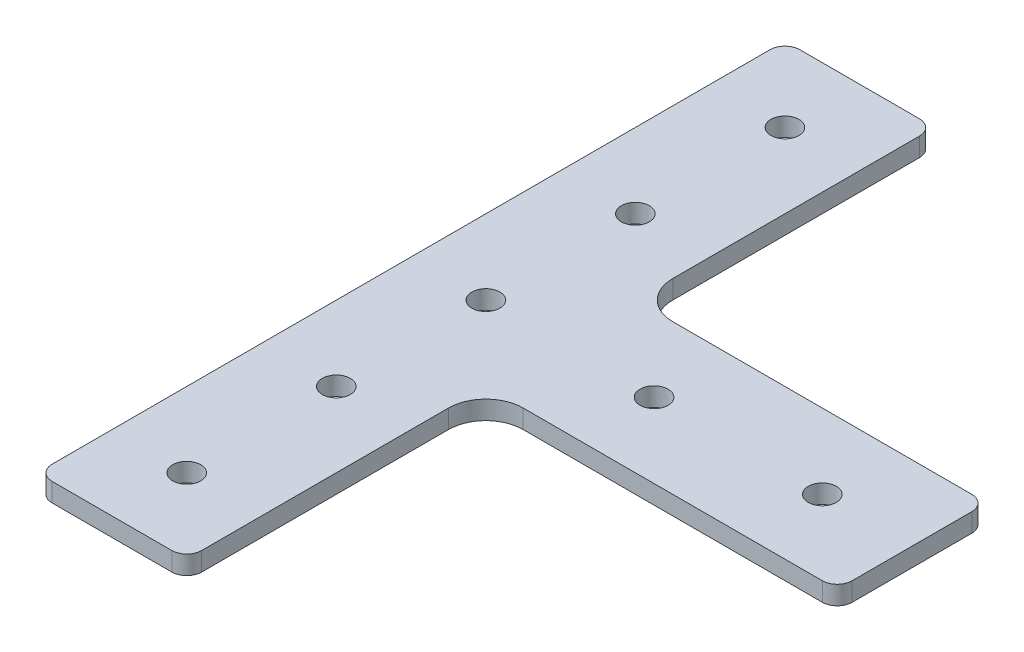
ISO-10303-21;
HEADER;
FILE_DESCRIPTION(('STEP AP214'),'2;1');
FILE_NAME('part.step','',(''),(''),'','','');
FILE_SCHEMA(('AUTOMOTIVE_DESIGN { 1 0 10303 214 1 1 1 1 }'));
ENDSEC;
DATA;
#1=APPLICATION_CONTEXT('core data for automotive mechanical design processes');
#2=APPLICATION_PROTOCOL_DEFINITION('international standard','automotive_design',2000,#1);
#3=PRODUCT_CONTEXT('',#1,'mechanical');
#4=PRODUCT('Part','Part','',(#3));
#5=PRODUCT_RELATED_PRODUCT_CATEGORY('part','',(#4));
#6=PRODUCT_DEFINITION_FORMATION('','',#4);
#7=PRODUCT_DEFINITION_CONTEXT('part definition',#1,'design');
#8=PRODUCT_DEFINITION('design','',#6,#7);
#9=PRODUCT_DEFINITION_SHAPE('','',#8);
#10=(LENGTH_UNIT() NAMED_UNIT(*) SI_UNIT(.MILLI.,.METRE.));
#11=(NAMED_UNIT(*) PLANE_ANGLE_UNIT() SI_UNIT($,.RADIAN.));
#12=(NAMED_UNIT(*) SI_UNIT($,.STERADIAN.) SOLID_ANGLE_UNIT());
#13=UNCERTAINTY_MEASURE_WITH_UNIT(LENGTH_MEASURE(1.E-05),#10,'distance_accuracy_value','');
#14=(GEOMETRIC_REPRESENTATION_CONTEXT(3) GLOBAL_UNCERTAINTY_ASSIGNED_CONTEXT((#13)) GLOBAL_UNIT_ASSIGNED_CONTEXT((#10,
#11,#12)) REPRESENTATION_CONTEXT('',''));
#15=CARTESIAN_POINT('',(0.,0.,0.));
#16=DIRECTION('',(0.,0.,1.));
#17=DIRECTION('',(1.,0.,0.));
#18=AXIS2_PLACEMENT_3D('',#15,#16,#17);
#19=CARTESIAN_POINT('',(19.05,3.175,44.45));
#20=DIRECTION('',(0.,-1.,0.));
#21=DIRECTION('',(0.,0.,-1.));
#22=AXIS2_PLACEMENT_3D('',#19,#20,#21);
#23=PLANE('',#22);
#24=CARTESIAN_POINT('',(19.05,3.175,44.45));
#25=DIRECTION('',(0.,-1.,0.));
#26=DIRECTION('',(0.,0.,-1.));
#27=AXIS2_PLACEMENT_3D('',#24,#25,#26);
#28=CIRCLE('',#27,6.35);
#29=CARTESIAN_POINT('',(12.7,3.175,44.45));
#30=VERTEX_POINT('',#29);
#31=CARTESIAN_POINT('',(19.0500000000001,3.175,38.1));
#32=VERTEX_POINT('',#31);
#33=EDGE_CURVE('E210',#30,#32,#28,.T.);
#34=ORIENTED_EDGE('',*,*,#33,.T.);
#35=DIRECTION('',(1.,0.,0.));
#36=VECTOR('',#35,1.);
#37=CARTESIAN_POINT('',(19.0500000000001,3.175,38.1));
#38=LINE('',#37,#36);
#39=CARTESIAN_POINT('',(69.85,3.175,38.1));
#40=VERTEX_POINT('',#39);
#41=EDGE_CURVE('E117',#32,#40,#38,.T.);
#42=ORIENTED_EDGE('',*,*,#41,.T.);
#43=CARTESIAN_POINT('',(69.85,3.175,35.56));
#44=DIRECTION('',(0.,1.,0.));
#45=DIRECTION('',(0.,0.,1.));
#46=AXIS2_PLACEMENT_3D('',#43,#44,#45);
#47=CIRCLE('',#46,2.54);
#48=CARTESIAN_POINT('',(72.39,3.175,35.56));
#49=VERTEX_POINT('',#48);
#50=EDGE_CURVE('E249',#40,#49,#47,.T.);
#51=ORIENTED_EDGE('',*,*,#50,.T.);
#52=DIRECTION('',(0.,0.,-1.));
#53=VECTOR('',#52,1.);
#54=CARTESIAN_POINT('',(72.39,3.175,35.56));
#55=LINE('',#54,#53);
#56=CARTESIAN_POINT('',(72.39,3.175,15.24));
#57=VERTEX_POINT('',#56);
#58=EDGE_CURVE('E268',#49,#57,#55,.T.);
#59=ORIENTED_EDGE('',*,*,#58,.T.);
#60=CARTESIAN_POINT('',(69.85,3.175,15.24));
#61=DIRECTION('',(0.,1.,0.));
#62=DIRECTION('',(0.,0.,1.));
#63=AXIS2_PLACEMENT_3D('',#60,#61,#62);
#64=CIRCLE('',#63,2.54);
#65=CARTESIAN_POINT('',(69.85,3.175,12.7));
#66=VERTEX_POINT('',#65);
#67=EDGE_CURVE('E265',#57,#66,#64,.T.);
#68=ORIENTED_EDGE('',*,*,#67,.T.);
#69=DIRECTION('',(-1.,0.,0.));
#70=VECTOR('',#69,1.);
#71=CARTESIAN_POINT('',(19.05,3.175,12.7));
#72=LINE('',#71,#70);
#73=CARTESIAN_POINT('',(19.05,3.175,12.7));
#74=VERTEX_POINT('',#73);
#75=EDGE_CURVE('E267',#66,#74,#72,.T.);
#76=ORIENTED_EDGE('',*,*,#75,.T.);
#77=CARTESIAN_POINT('',(19.05,3.175,6.35));
#78=DIRECTION('',(0.,-1.,0.));
#79=DIRECTION('',(0.,0.,-1.));
#80=AXIS2_PLACEMENT_3D('',#77,#78,#79);
#81=CIRCLE('',#80,6.35);
#82=CARTESIAN_POINT('',(12.7,3.175,6.35));
#83=VERTEX_POINT('',#82);
#84=EDGE_CURVE('E270',#74,#83,#81,.T.);
#85=ORIENTED_EDGE('',*,*,#84,.T.);
#86=DIRECTION('',(0.,0.,-1.));
#87=VECTOR('',#86,1.);
#88=CARTESIAN_POINT('',(12.7,3.175,6.35));
#89=LINE('',#88,#87);
#90=CARTESIAN_POINT('',(12.7,3.175,-35.56));
#91=VERTEX_POINT('',#90);
#92=EDGE_CURVE('E276',#83,#91,#89,.T.);
#93=ORIENTED_EDGE('',*,*,#92,.T.);
#94=CARTESIAN_POINT('',(10.16,3.175,-35.56));
#95=DIRECTION('',(0.,1.,0.));
#96=DIRECTION('',(0.,0.,1.));
#97=AXIS2_PLACEMENT_3D('',#94,#95,#96);
#98=CIRCLE('',#97,2.54);
#99=CARTESIAN_POINT('',(10.16,3.175,-38.1));
#100=VERTEX_POINT('',#99);
#101=EDGE_CURVE('E278',#91,#100,#98,.T.);
#102=ORIENTED_EDGE('',*,*,#101,.T.);
#103=DIRECTION('',(-1.,0.,0.));
#104=VECTOR('',#103,1.);
#105=CARTESIAN_POINT('',(-10.16,3.175,-38.1));
#106=LINE('',#105,#104);
#107=CARTESIAN_POINT('',(-10.16,3.175,-38.1));
#108=VERTEX_POINT('',#107);
#109=EDGE_CURVE('E280',#100,#108,#106,.T.);
#110=ORIENTED_EDGE('',*,*,#109,.T.);
#111=CARTESIAN_POINT('',(-10.16,3.175,-35.56));
#112=DIRECTION('',(0.,1.,0.));
#113=DIRECTION('',(0.,0.,-1.));
#114=AXIS2_PLACEMENT_3D('',#111,#112,#113);
#115=CIRCLE('',#114,2.54);
#116=CARTESIAN_POINT('',(-12.7,3.175,-35.56));
#117=VERTEX_POINT('',#116);
#118=EDGE_CURVE('E282',#108,#117,#115,.T.);
#119=ORIENTED_EDGE('',*,*,#118,.T.);
#120=DIRECTION('',(0.,0.,1.));
#121=VECTOR('',#120,1.);
#122=CARTESIAN_POINT('',(-12.7,3.175,35.56));
#123=LINE('',#122,#121);
#124=CARTESIAN_POINT('',(-12.7,3.175,86.36));
#125=VERTEX_POINT('',#124);
#126=EDGE_CURVE('E284',#117,#125,#123,.T.);
#127=ORIENTED_EDGE('',*,*,#126,.T.);
#128=CARTESIAN_POINT('',(-10.16,3.175,86.36));
#129=DIRECTION('',(0.,1.,0.));
#130=DIRECTION('',(0.,0.,-1.));
#131=AXIS2_PLACEMENT_3D('',#128,#129,#130);
#132=CIRCLE('',#131,2.54);
#133=CARTESIAN_POINT('',(-10.16,3.175,88.9));
#134=VERTEX_POINT('',#133);
#135=EDGE_CURVE('E160',#125,#134,#132,.T.);
#136=ORIENTED_EDGE('',*,*,#135,.T.);
#137=DIRECTION('',(1.,0.,0.));
#138=VECTOR('',#137,1.);
#139=CARTESIAN_POINT('',(10.16,3.175,88.9));
#140=LINE('',#139,#138);
#141=CARTESIAN_POINT('',(10.16,3.175,88.9));
#142=VERTEX_POINT('',#141);
#143=EDGE_CURVE('E154',#134,#142,#140,.T.);
#144=ORIENTED_EDGE('',*,*,#143,.T.);
#145=CARTESIAN_POINT('',(10.16,3.175,86.36));
#146=DIRECTION('',(0.,1.,0.));
#147=DIRECTION('',(0.,0.,-1.));
#148=AXIS2_PLACEMENT_3D('',#145,#146,#147);
#149=CIRCLE('',#148,2.54);
#150=CARTESIAN_POINT('',(12.7,3.175,86.36));
#151=VERTEX_POINT('',#150);
#152=EDGE_CURVE('E158',#142,#151,#149,.T.);
#153=ORIENTED_EDGE('',*,*,#152,.T.);
#154=DIRECTION('',(0.,0.,-1.));
#155=VECTOR('',#154,1.);
#156=CARTESIAN_POINT('',(12.7,3.175,44.45));
#157=LINE('',#156,#155);
#158=EDGE_CURVE('E50',#151,#30,#157,.T.);
#159=ORIENTED_EDGE('',*,*,#158,.T.);
#160=EDGE_LOOP('',(#34,#42,#51,#59,#68,#76,#85,#93,#102,#110,#119,#127,#136,#144,#153,#159));
#161=FACE_BOUND('',#160,.T.);
#162=CARTESIAN_POINT('',(0.,3.175,25.4));
#163=DIRECTION('',(0.,1.,0.));
#164=DIRECTION('',(0.,0.,1.));
#165=AXIS2_PLACEMENT_3D('',#162,#163,#164);
#166=CIRCLE('',#165,2.38125);
#167=CARTESIAN_POINT('',(0.,3.175,27.78125));
#168=VERTEX_POINT('',#167);
#169=EDGE_CURVE('E182',#168,#168,#166,.T.);
#170=ORIENTED_EDGE('',*,*,#169,.F.);
#171=EDGE_LOOP('',(#170));
#172=FACE_BOUND('',#171,.T.);
#173=CARTESIAN_POINT('',(0.,3.175,0.));
#174=DIRECTION('',(0.,1.,0.));
#175=DIRECTION('',(0.,0.,1.));
#176=AXIS2_PLACEMENT_3D('',#173,#174,#175);
#177=CIRCLE('',#176,2.38125);
#178=CARTESIAN_POINT('',(0.,3.175,2.38125));
#179=VERTEX_POINT('',#178);
#180=EDGE_CURVE('E377',#179,#179,#177,.T.);
#181=ORIENTED_EDGE('',*,*,#180,.F.);
#182=EDGE_LOOP('',(#181));
#183=FACE_BOUND('',#182,.T.);
#184=CARTESIAN_POINT('',(0.,3.175,-25.4));
#185=DIRECTION('',(0.,1.,0.));
#186=DIRECTION('',(0.,0.,1.));
#187=AXIS2_PLACEMENT_3D('',#184,#185,#186);
#188=CIRCLE('',#187,2.38125);
#189=CARTESIAN_POINT('',(0.,3.175,-23.01875));
#190=VERTEX_POINT('',#189);
#191=EDGE_CURVE('E371',#190,#190,#188,.T.);
#192=ORIENTED_EDGE('',*,*,#191,.F.);
#193=EDGE_LOOP('',(#192));
#194=FACE_BOUND('',#193,.T.);
#195=CARTESIAN_POINT('',(28.575,3.175,25.4));
#196=DIRECTION('',(0.,1.,0.));
#197=DIRECTION('',(0.,0.,1.));
#198=AXIS2_PLACEMENT_3D('',#195,#196,#197);
#199=CIRCLE('',#198,2.38125);
#200=CARTESIAN_POINT('',(28.575,3.175,27.78125));
#201=VERTEX_POINT('',#200);
#202=EDGE_CURVE('E365',#201,#201,#199,.T.);
#203=ORIENTED_EDGE('',*,*,#202,.F.);
#204=EDGE_LOOP('',(#203));
#205=FACE_BOUND('',#204,.T.);
#206=CARTESIAN_POINT('',(57.15,3.175,25.4));
#207=DIRECTION('',(0.,1.,0.));
#208=DIRECTION('',(0.,0.,1.));
#209=AXIS2_PLACEMENT_3D('',#206,#207,#208);
#210=CIRCLE('',#209,2.38125);
#211=CARTESIAN_POINT('',(57.15,3.175,27.78125));
#212=VERTEX_POINT('',#211);
#213=EDGE_CURVE('E359',#212,#212,#210,.T.);
#214=ORIENTED_EDGE('',*,*,#213,.F.);
#215=EDGE_LOOP('',(#214));
#216=FACE_BOUND('',#215,.T.);
#217=CARTESIAN_POINT('',(0.,3.175,76.2));
#218=DIRECTION('',(0.,1.,0.));
#219=DIRECTION('',(0.,0.,-1.));
#220=AXIS2_PLACEMENT_3D('',#217,#218,#219);
#221=CIRCLE('',#220,2.38125);
#222=CARTESIAN_POINT('',(0.,3.175,73.81875));
#223=VERTEX_POINT('',#222);
#224=EDGE_CURVE('E353',#223,#223,#221,.T.);
#225=ORIENTED_EDGE('',*,*,#224,.F.);
#226=EDGE_LOOP('',(#225));
#227=FACE_BOUND('',#226,.T.);
#228=CARTESIAN_POINT('',(0.,3.175,50.8));
#229=DIRECTION('',(0.,1.,0.));
#230=DIRECTION('',(0.,0.,-1.));
#231=AXIS2_PLACEMENT_3D('',#228,#229,#230);
#232=CIRCLE('',#231,2.38125);
#233=CARTESIAN_POINT('',(0.,3.175,48.41875));
#234=VERTEX_POINT('',#233);
#235=EDGE_CURVE('E344',#234,#234,#232,.T.);
#236=ORIENTED_EDGE('',*,*,#235,.F.);
#237=EDGE_LOOP('',(#236));
#238=FACE_BOUND('',#237,.T.);
#239=ADVANCED_FACE('F33',(#161,#172,#183,#194,#205,#216,#227,#238),#23,.F.);
#240=CARTESIAN_POINT('',(19.05,0.,44.45));
#241=DIRECTION('',(0.,-1.,0.));
#242=DIRECTION('',(0.,0.,-1.));
#243=AXIS2_PLACEMENT_3D('',#240,#241,#242);
#244=PLANE('',#243);
#245=CARTESIAN_POINT('',(0.,0.,76.2));
#246=DIRECTION('',(0.,1.,0.));
#247=DIRECTION('',(0.,0.,-1.));
#248=AXIS2_PLACEMENT_3D('',#245,#246,#247);
#249=CIRCLE('',#248,2.38125);
#250=CARTESIAN_POINT('',(0.,0.,73.81875));
#251=VERTEX_POINT('',#250);
#252=EDGE_CURVE('E350',#251,#251,#249,.T.);
#253=ORIENTED_EDGE('',*,*,#252,.T.);
#254=EDGE_LOOP('',(#253));
#255=FACE_BOUND('',#254,.T.);
#256=CARTESIAN_POINT('',(28.575,0.,25.4));
#257=DIRECTION('',(0.,1.,0.));
#258=DIRECTION('',(0.,0.,1.));
#259=AXIS2_PLACEMENT_3D('',#256,#257,#258);
#260=CIRCLE('',#259,2.38125);
#261=CARTESIAN_POINT('',(28.575,0.,27.78125));
#262=VERTEX_POINT('',#261);
#263=EDGE_CURVE('E362',#262,#262,#260,.T.);
#264=ORIENTED_EDGE('',*,*,#263,.T.);
#265=EDGE_LOOP('',(#264));
#266=FACE_BOUND('',#265,.T.);
#267=CARTESIAN_POINT('',(0.,0.,0.));
#268=DIRECTION('',(0.,1.,0.));
#269=DIRECTION('',(0.,0.,1.));
#270=AXIS2_PLACEMENT_3D('',#267,#268,#269);
#271=CIRCLE('',#270,2.38125);
#272=CARTESIAN_POINT('',(0.,0.,2.38125));
#273=VERTEX_POINT('',#272);
#274=EDGE_CURVE('E374',#273,#273,#271,.T.);
#275=ORIENTED_EDGE('',*,*,#274,.T.);
#276=EDGE_LOOP('',(#275));
#277=FACE_BOUND('',#276,.T.);
#278=CARTESIAN_POINT('',(19.05,0.,44.45));
#279=DIRECTION('',(0.,-1.,0.));
#280=DIRECTION('',(0.,0.,-1.));
#281=AXIS2_PLACEMENT_3D('',#278,#279,#280);
#282=CIRCLE('',#281,6.35);
#283=CARTESIAN_POINT('',(12.7,0.,44.45));
#284=VERTEX_POINT('',#283);
#285=CARTESIAN_POINT('',(19.0500000000001,0.,38.1));
#286=VERTEX_POINT('',#285);
#287=EDGE_CURVE('E178',#284,#286,#282,.T.);
#288=ORIENTED_EDGE('',*,*,#287,.F.);
#289=DIRECTION('',(0.,0.,-1.));
#290=VECTOR('',#289,1.);
#291=CARTESIAN_POINT('',(12.7,0.,44.45));
#292=LINE('',#291,#290);
#293=CARTESIAN_POINT('',(12.7,0.,86.36));
#294=VERTEX_POINT('',#293);
#295=EDGE_CURVE('E109',#294,#284,#292,.T.);
#296=ORIENTED_EDGE('',*,*,#295,.F.);
#297=CARTESIAN_POINT('',(10.16,0.,86.36));
#298=DIRECTION('',(0.,1.,0.));
#299=DIRECTION('',(0.,0.,-1.));
#300=AXIS2_PLACEMENT_3D('',#297,#298,#299);
#301=CIRCLE('',#300,2.54);
#302=CARTESIAN_POINT('',(10.16,0.,88.9));
#303=VERTEX_POINT('',#302);
#304=EDGE_CURVE('E103',#303,#294,#301,.T.);
#305=ORIENTED_EDGE('',*,*,#304,.F.);
#306=DIRECTION('',(1.,0.,0.));
#307=VECTOR('',#306,1.);
#308=CARTESIAN_POINT('',(10.16,0.,88.9));
#309=LINE('',#308,#307);
#310=CARTESIAN_POINT('',(-10.16,0.,88.9));
#311=VERTEX_POINT('',#310);
#312=EDGE_CURVE('E168',#311,#303,#309,.T.);
#313=ORIENTED_EDGE('',*,*,#312,.F.);
#314=CARTESIAN_POINT('',(-10.16,0.,86.36));
#315=DIRECTION('',(0.,1.,0.));
#316=DIRECTION('',(0.,0.,-1.));
#317=AXIS2_PLACEMENT_3D('',#314,#315,#316);
#318=CIRCLE('',#317,2.54);
#319=CARTESIAN_POINT('',(-12.7,0.,86.36));
#320=VERTEX_POINT('',#319);
#321=EDGE_CURVE('E205',#320,#311,#318,.T.);
#322=ORIENTED_EDGE('',*,*,#321,.F.);
#323=DIRECTION('',(0.,0.,1.));
#324=VECTOR('',#323,1.);
#325=CARTESIAN_POINT('',(-12.7,0.,38.1));
#326=LINE('',#325,#324);
#327=CARTESIAN_POINT('',(-12.7,0.,-35.56));
#328=VERTEX_POINT('',#327);
#329=EDGE_CURVE('E203',#328,#320,#326,.T.);
#330=ORIENTED_EDGE('',*,*,#329,.F.);
#331=CARTESIAN_POINT('',(-10.16,0.,-35.56));
#332=DIRECTION('',(0.,1.,0.));
#333=DIRECTION('',(0.,0.,-1.));
#334=AXIS2_PLACEMENT_3D('',#331,#332,#333);
#335=CIRCLE('',#334,2.54);
#336=CARTESIAN_POINT('',(-10.16,0.,-38.1));
#337=VERTEX_POINT('',#336);
#338=EDGE_CURVE('E200',#337,#328,#335,.T.);
#339=ORIENTED_EDGE('',*,*,#338,.F.);
#340=DIRECTION('',(-1.,0.,0.));
#341=VECTOR('',#340,1.);
#342=CARTESIAN_POINT('',(-10.16,0.,-38.1));
#343=LINE('',#342,#341);
#344=CARTESIAN_POINT('',(10.16,0.,-38.1));
#345=VERTEX_POINT('',#344);
#346=EDGE_CURVE('E198',#345,#337,#343,.T.);
#347=ORIENTED_EDGE('',*,*,#346,.F.);
#348=CARTESIAN_POINT('',(10.16,0.,-35.56));
#349=DIRECTION('',(0.,1.,0.));
#350=DIRECTION('',(0.,0.,1.));
#351=AXIS2_PLACEMENT_3D('',#348,#349,#350);
#352=CIRCLE('',#351,2.54);
#353=CARTESIAN_POINT('',(12.7,0.,-35.56));
#354=VERTEX_POINT('',#353);
#355=EDGE_CURVE('E196',#354,#345,#352,.T.);
#356=ORIENTED_EDGE('',*,*,#355,.F.);
#357=DIRECTION('',(0.,0.,-1.));
#358=VECTOR('',#357,1.);
#359=CARTESIAN_POINT('',(12.7,0.,6.35));
#360=LINE('',#359,#358);
#361=CARTESIAN_POINT('',(12.7,0.,6.35));
#362=VERTEX_POINT('',#361);
#363=EDGE_CURVE('E194',#362,#354,#360,.T.);
#364=ORIENTED_EDGE('',*,*,#363,.F.);
#365=CARTESIAN_POINT('',(19.05,0.,6.35));
#366=DIRECTION('',(0.,-1.,0.));
#367=DIRECTION('',(0.,0.,-1.));
#368=AXIS2_PLACEMENT_3D('',#365,#366,#367);
#369=CIRCLE('',#368,6.35);
#370=CARTESIAN_POINT('',(19.05,0.,12.7));
#371=VERTEX_POINT('',#370);
#372=EDGE_CURVE('E192',#371,#362,#369,.T.);
#373=ORIENTED_EDGE('',*,*,#372,.F.);
#374=DIRECTION('',(-1.,0.,0.));
#375=VECTOR('',#374,1.);
#376=CARTESIAN_POINT('',(19.05,0.,12.7));
#377=LINE('',#376,#375);
#378=CARTESIAN_POINT('',(69.85,0.,12.7));
#379=VERTEX_POINT('',#378);
#380=EDGE_CURVE('E190',#379,#371,#377,.T.);
#381=ORIENTED_EDGE('',*,*,#380,.F.);
#382=CARTESIAN_POINT('',(69.85,0.,15.24));
#383=DIRECTION('',(0.,1.,0.));
#384=DIRECTION('',(0.,0.,1.));
#385=AXIS2_PLACEMENT_3D('',#382,#383,#384);
#386=CIRCLE('',#385,2.54);
#387=CARTESIAN_POINT('',(72.39,0.,15.24));
#388=VERTEX_POINT('',#387);
#389=EDGE_CURVE('E188',#388,#379,#386,.T.);
#390=ORIENTED_EDGE('',*,*,#389,.F.);
#391=DIRECTION('',(0.,0.,-1.));
#392=VECTOR('',#391,1.);
#393=CARTESIAN_POINT('',(72.39,0.,35.56));
#394=LINE('',#393,#392);
#395=CARTESIAN_POINT('',(72.39,0.,35.56));
#396=VERTEX_POINT('',#395);
#397=EDGE_CURVE('E186',#396,#388,#394,.T.);
#398=ORIENTED_EDGE('',*,*,#397,.F.);
#399=CARTESIAN_POINT('',(69.85,0.,35.56));
#400=DIRECTION('',(0.,1.,0.));
#401=DIRECTION('',(0.,0.,1.));
#402=AXIS2_PLACEMENT_3D('',#399,#400,#401);
#403=CIRCLE('',#402,2.54);
#404=CARTESIAN_POINT('',(69.85,0.,38.1));
#405=VERTEX_POINT('',#404);
#406=EDGE_CURVE('E184',#405,#396,#403,.T.);
#407=ORIENTED_EDGE('',*,*,#406,.F.);
#408=DIRECTION('',(1.,0.,0.));
#409=VECTOR('',#408,1.);
#410=CARTESIAN_POINT('',(19.0500000000001,0.,38.1));
#411=LINE('',#410,#409);
#412=EDGE_CURVE('E181',#286,#405,#411,.T.);
#413=ORIENTED_EDGE('',*,*,#412,.F.);
#414=EDGE_LOOP('',(#288,#296,#305,#313,#322,#330,#339,#347,#356,#364,#373,#381,#390,#398,#407,#413));
#415=FACE_BOUND('',#414,.T.);
#416=CARTESIAN_POINT('',(0.,0.,25.4));
#417=DIRECTION('',(0.,1.,0.));
#418=DIRECTION('',(0.,0.,1.));
#419=AXIS2_PLACEMENT_3D('',#416,#417,#418);
#420=CIRCLE('',#419,2.38125);
#421=CARTESIAN_POINT('',(0.,0.,27.78125));
#422=VERTEX_POINT('',#421);
#423=EDGE_CURVE('E380',#422,#422,#420,.T.);
#424=ORIENTED_EDGE('',*,*,#423,.T.);
#425=EDGE_LOOP('',(#424));
#426=FACE_BOUND('',#425,.T.);
#427=CARTESIAN_POINT('',(0.,0.,-25.4));
#428=DIRECTION('',(0.,1.,0.));
#429=DIRECTION('',(0.,0.,1.));
#430=AXIS2_PLACEMENT_3D('',#427,#428,#429);
#431=CIRCLE('',#430,2.38125);
#432=CARTESIAN_POINT('',(0.,0.,-23.01875));
#433=VERTEX_POINT('',#432);
#434=EDGE_CURVE('E368',#433,#433,#431,.T.);
#435=ORIENTED_EDGE('',*,*,#434,.T.);
#436=EDGE_LOOP('',(#435));
#437=FACE_BOUND('',#436,.T.);
#438=CARTESIAN_POINT('',(57.15,0.,25.4));
#439=DIRECTION('',(0.,1.,0.));
#440=DIRECTION('',(0.,0.,1.));
#441=AXIS2_PLACEMENT_3D('',#438,#439,#440);
#442=CIRCLE('',#441,2.38125);
#443=CARTESIAN_POINT('',(57.15,0.,27.78125));
#444=VERTEX_POINT('',#443);
#445=EDGE_CURVE('E356',#444,#444,#442,.T.);
#446=ORIENTED_EDGE('',*,*,#445,.T.);
#447=EDGE_LOOP('',(#446));
#448=FACE_BOUND('',#447,.T.);
#449=CARTESIAN_POINT('',(0.,0.,50.8));
#450=DIRECTION('',(0.,1.,0.));
#451=DIRECTION('',(0.,0.,-1.));
#452=AXIS2_PLACEMENT_3D('',#449,#450,#451);
#453=CIRCLE('',#452,2.38125);
#454=CARTESIAN_POINT('',(0.,0.,48.41875));
#455=VERTEX_POINT('',#454);
#456=EDGE_CURVE('E347',#455,#455,#453,.T.);
#457=ORIENTED_EDGE('',*,*,#456,.T.);
#458=EDGE_LOOP('',(#457));
#459=FACE_BOUND('',#458,.T.);
#460=ADVANCED_FACE('F253',(#255,#266,#277,#415,#426,#437,#448,#459),#244,.T.);
#461=CARTESIAN_POINT('',(19.05,3.175,44.45));
#462=DIRECTION('',(0.,-1.,0.));
#463=DIRECTION('',(0.,0.,-1.));
#464=AXIS2_PLACEMENT_3D('',#461,#462,#463);
#465=CYLINDRICAL_SURFACE('',#464,6.35);
#466=ORIENTED_EDGE('',*,*,#287,.T.);
#467=DIRECTION('',(0.,-1.,0.));
#468=VECTOR('',#467,1.);
#469=CARTESIAN_POINT('',(19.0500000000001,3.175,38.1));
#470=LINE('',#469,#468);
#471=EDGE_CURVE('E11',#32,#286,#470,.T.);
#472=ORIENTED_EDGE('',*,*,#471,.F.);
#473=ORIENTED_EDGE('',*,*,#33,.F.);
#474=DIRECTION('',(0.,-1.,0.));
#475=VECTOR('',#474,1.);
#476=CARTESIAN_POINT('',(12.7,3.175,44.45));
#477=LINE('',#476,#475);
#478=EDGE_CURVE('E174',#30,#284,#477,.T.);
#479=ORIENTED_EDGE('',*,*,#478,.T.);
#480=EDGE_LOOP('',(#466,#472,#473,#479));
#481=FACE_BOUND('',#480,.T.);
#482=ADVANCED_FACE('F35',(#481),#465,.F.);
#483=CARTESIAN_POINT('',(19.0500000000001,3.175,38.1));
#484=DIRECTION('',(0.,0.,-1.));
#485=DIRECTION('',(-1.,0.,0.));
#486=AXIS2_PLACEMENT_3D('',#483,#484,#485);
#487=PLANE('',#486);
#488=ORIENTED_EDGE('',*,*,#412,.T.);
#489=DIRECTION('',(0.,-1.,0.));
#490=VECTOR('',#489,1.);
#491=CARTESIAN_POINT('',(69.85,3.175,38.1));
#492=LINE('',#491,#490);
#493=EDGE_CURVE('E42',#40,#405,#492,.T.);
#494=ORIENTED_EDGE('',*,*,#493,.F.);
#495=ORIENTED_EDGE('',*,*,#41,.F.);
#496=ORIENTED_EDGE('',*,*,#471,.T.);
#497=EDGE_LOOP('',(#488,#494,#495,#496));
#498=FACE_BOUND('',#497,.T.);
#499=ADVANCED_FACE('F561',(#498),#487,.F.);
#500=CARTESIAN_POINT('',(69.85,3.175,35.56));
#501=DIRECTION('',(0.,-1.,0.));
#502=DIRECTION('',(0.,0.,-1.));
#503=AXIS2_PLACEMENT_3D('',#500,#501,#502);
#504=CYLINDRICAL_SURFACE('',#503,2.54);
#505=ORIENTED_EDGE('',*,*,#406,.T.);
#506=DIRECTION('',(0.,-1.,0.));
#507=VECTOR('',#506,1.);
#508=CARTESIAN_POINT('',(72.39,3.175,35.56));
#509=LINE('',#508,#507);
#510=EDGE_CURVE('E241',#49,#396,#509,.T.);
#511=ORIENTED_EDGE('',*,*,#510,.F.);
#512=ORIENTED_EDGE('',*,*,#50,.F.);
#513=ORIENTED_EDGE('',*,*,#493,.T.);
#514=EDGE_LOOP('',(#505,#511,#512,#513));
#515=FACE_BOUND('',#514,.T.);
#516=ADVANCED_FACE('F247',(#515),#504,.T.);
#517=CARTESIAN_POINT('',(72.39,3.175,35.56));
#518=DIRECTION('',(-1.,0.,0.));
#519=DIRECTION('',(0.,0.,1.));
#520=AXIS2_PLACEMENT_3D('',#517,#518,#519);
#521=PLANE('',#520);
#522=ORIENTED_EDGE('',*,*,#397,.T.);
#523=DIRECTION('',(0.,-1.,0.));
#524=VECTOR('',#523,1.);
#525=CARTESIAN_POINT('',(72.39,3.175,15.24));
#526=LINE('',#525,#524);
#527=EDGE_CURVE('E238',#57,#388,#526,.T.);
#528=ORIENTED_EDGE('',*,*,#527,.F.);
#529=ORIENTED_EDGE('',*,*,#58,.F.);
#530=ORIENTED_EDGE('',*,*,#510,.T.);
#531=EDGE_LOOP('',(#522,#528,#529,#530));
#532=FACE_BOUND('',#531,.T.);
#533=ADVANCED_FACE('F259',(#532),#521,.F.);
#534=CARTESIAN_POINT('',(69.85,3.175,15.24));
#535=DIRECTION('',(0.,-1.,0.));
#536=DIRECTION('',(0.,0.,-1.));
#537=AXIS2_PLACEMENT_3D('',#534,#535,#536);
#538=CYLINDRICAL_SURFACE('',#537,2.54);
#539=ORIENTED_EDGE('',*,*,#389,.T.);
#540=DIRECTION('',(0.,-1.,0.));
#541=VECTOR('',#540,1.);
#542=CARTESIAN_POINT('',(69.85,3.175,12.7));
#543=LINE('',#542,#541);
#544=EDGE_CURVE('E235',#66,#379,#543,.T.);
#545=ORIENTED_EDGE('',*,*,#544,.F.);
#546=ORIENTED_EDGE('',*,*,#67,.F.);
#547=ORIENTED_EDGE('',*,*,#527,.T.);
#548=EDGE_LOOP('',(#539,#545,#546,#547));
#549=FACE_BOUND('',#548,.T.);
#550=ADVANCED_FACE('F263',(#549),#538,.T.);
#551=CARTESIAN_POINT('',(19.05,3.175,12.7));
#552=DIRECTION('',(0.,0.,1.));
#553=DIRECTION('',(1.,0.,0.));
#554=AXIS2_PLACEMENT_3D('',#551,#552,#553);
#555=PLANE('',#554);
#556=ORIENTED_EDGE('',*,*,#380,.T.);
#557=DIRECTION('',(0.,-1.,0.));
#558=VECTOR('',#557,1.);
#559=CARTESIAN_POINT('',(19.05,3.175,12.7));
#560=LINE('',#559,#558);
#561=EDGE_CURVE('E232',#74,#371,#560,.T.);
#562=ORIENTED_EDGE('',*,*,#561,.F.);
#563=ORIENTED_EDGE('',*,*,#75,.F.);
#564=ORIENTED_EDGE('',*,*,#544,.T.);
#565=EDGE_LOOP('',(#556,#562,#563,#564));
#566=FACE_BOUND('',#565,.T.);
#567=ADVANCED_FACE('F526',(#566),#555,.F.);
#568=CARTESIAN_POINT('',(19.05,3.175,6.35));
#569=DIRECTION('',(0.,-1.,0.));
#570=DIRECTION('',(0.,0.,-1.));
#571=AXIS2_PLACEMENT_3D('',#568,#569,#570);
#572=CYLINDRICAL_SURFACE('',#571,6.35);
#573=ORIENTED_EDGE('',*,*,#372,.T.);
#574=DIRECTION('',(0.,-1.,0.));
#575=VECTOR('',#574,1.);
#576=CARTESIAN_POINT('',(12.7,3.175,6.35));
#577=LINE('',#576,#575);
#578=EDGE_CURVE('E229',#83,#362,#577,.T.);
#579=ORIENTED_EDGE('',*,*,#578,.F.);
#580=ORIENTED_EDGE('',*,*,#84,.F.);
#581=ORIENTED_EDGE('',*,*,#561,.T.);
#582=EDGE_LOOP('',(#573,#579,#580,#581));
#583=FACE_BOUND('',#582,.T.);
#584=ADVANCED_FACE('F516',(#583),#572,.F.);
#585=CARTESIAN_POINT('',(12.7,3.175,6.35));
#586=DIRECTION('',(-1.,0.,0.));
#587=DIRECTION('',(0.,0.,1.));
#588=AXIS2_PLACEMENT_3D('',#585,#586,#587);
#589=PLANE('',#588);
#590=ORIENTED_EDGE('',*,*,#363,.T.);
#591=DIRECTION('',(0.,-1.,0.));
#592=VECTOR('',#591,1.);
#593=CARTESIAN_POINT('',(12.7,3.175,-35.56));
#594=LINE('',#593,#592);
#595=EDGE_CURVE('E226',#91,#354,#594,.T.);
#596=ORIENTED_EDGE('',*,*,#595,.F.);
#597=ORIENTED_EDGE('',*,*,#92,.F.);
#598=ORIENTED_EDGE('',*,*,#578,.T.);
#599=EDGE_LOOP('',(#590,#596,#597,#598));
#600=FACE_BOUND('',#599,.T.);
#601=ADVANCED_FACE('F506',(#600),#589,.F.);
#602=CARTESIAN_POINT('',(10.16,3.175,-35.56));
#603=DIRECTION('',(0.,-1.,0.));
#604=DIRECTION('',(0.,0.,-1.));
#605=AXIS2_PLACEMENT_3D('',#602,#603,#604);
#606=CYLINDRICAL_SURFACE('',#605,2.54);
#607=ORIENTED_EDGE('',*,*,#355,.T.);
#608=DIRECTION('',(0.,-1.,0.));
#609=VECTOR('',#608,1.);
#610=CARTESIAN_POINT('',(10.16,3.175,-38.1));
#611=LINE('',#610,#609);
#612=EDGE_CURVE('E223',#100,#345,#611,.T.);
#613=ORIENTED_EDGE('',*,*,#612,.F.);
#614=ORIENTED_EDGE('',*,*,#101,.F.);
#615=ORIENTED_EDGE('',*,*,#595,.T.);
#616=EDGE_LOOP('',(#607,#613,#614,#615));
#617=FACE_BOUND('',#616,.T.);
#618=ADVANCED_FACE('F496',(#617),#606,.T.);
#619=CARTESIAN_POINT('',(-10.16,3.175,-38.1));
#620=DIRECTION('',(0.,0.,1.));
#621=DIRECTION('',(1.,0.,0.));
#622=AXIS2_PLACEMENT_3D('',#619,#620,#621);
#623=PLANE('',#622);
#624=ORIENTED_EDGE('',*,*,#346,.T.);
#625=DIRECTION('',(0.,-1.,0.));
#626=VECTOR('',#625,1.);
#627=CARTESIAN_POINT('',(-10.16,3.175,-38.1));
#628=LINE('',#627,#626);
#629=EDGE_CURVE('E220',#108,#337,#628,.T.);
#630=ORIENTED_EDGE('',*,*,#629,.F.);
#631=ORIENTED_EDGE('',*,*,#109,.F.);
#632=ORIENTED_EDGE('',*,*,#612,.T.);
#633=EDGE_LOOP('',(#624,#630,#631,#632));
#634=FACE_BOUND('',#633,.T.);
#635=ADVANCED_FACE('F485',(#634),#623,.F.);
#636=CARTESIAN_POINT('',(-10.16,3.175,-35.56));
#637=DIRECTION('',(0.,-1.,0.));
#638=DIRECTION('',(0.,0.,-1.));
#639=AXIS2_PLACEMENT_3D('',#636,#637,#638);
#640=CYLINDRICAL_SURFACE('',#639,2.54);
#641=ORIENTED_EDGE('',*,*,#338,.T.);
#642=DIRECTION('',(0.,-1.,0.));
#643=VECTOR('',#642,1.);
#644=CARTESIAN_POINT('',(-12.7,3.175,-35.56));
#645=LINE('',#644,#643);
#646=EDGE_CURVE('E217',#117,#328,#645,.T.);
#647=ORIENTED_EDGE('',*,*,#646,.F.);
#648=ORIENTED_EDGE('',*,*,#118,.F.);
#649=ORIENTED_EDGE('',*,*,#629,.T.);
#650=EDGE_LOOP('',(#641,#647,#648,#649));
#651=FACE_BOUND('',#650,.T.);
#652=ADVANCED_FACE('F475',(#651),#640,.T.);
#653=CARTESIAN_POINT('',(-12.7,3.175,38.1));
#654=DIRECTION('',(1.,0.,0.));
#655=DIRECTION('',(0.,0.,-1.));
#656=AXIS2_PLACEMENT_3D('',#653,#654,#655);
#657=PLANE('',#656);
#658=ORIENTED_EDGE('',*,*,#329,.T.);
#659=DIRECTION('',(0.,-1.,0.));
#660=VECTOR('',#659,1.);
#661=CARTESIAN_POINT('',(-12.7,3.175,86.36));
#662=LINE('',#661,#660);
#663=EDGE_CURVE('E214',#125,#320,#662,.T.);
#664=ORIENTED_EDGE('',*,*,#663,.F.);
#665=ORIENTED_EDGE('',*,*,#126,.F.);
#666=ORIENTED_EDGE('',*,*,#646,.T.);
#667=EDGE_LOOP('',(#658,#664,#665,#666));
#668=FACE_BOUND('',#667,.T.);
#669=ADVANCED_FACE('F290',(#668),#657,.F.);
#670=CARTESIAN_POINT('',(-10.16,3.175,86.36));
#671=DIRECTION('',(0.,-1.,0.));
#672=DIRECTION('',(0.,0.,-1.));
#673=AXIS2_PLACEMENT_3D('',#670,#671,#672);
#674=CYLINDRICAL_SURFACE('',#673,2.54);
#675=ORIENTED_EDGE('',*,*,#321,.T.);
#676=DIRECTION('',(0.,-1.,0.));
#677=VECTOR('',#676,1.);
#678=CARTESIAN_POINT('',(-10.16,3.175,88.9));
#679=LINE('',#678,#677);
#680=EDGE_CURVE('E169',#134,#311,#679,.T.);
#681=ORIENTED_EDGE('',*,*,#680,.F.);
#682=ORIENTED_EDGE('',*,*,#135,.F.);
#683=ORIENTED_EDGE('',*,*,#663,.T.);
#684=EDGE_LOOP('',(#675,#681,#682,#683));
#685=FACE_BOUND('',#684,.T.);
#686=ADVANCED_FACE('F293',(#685),#674,.T.);
#687=CARTESIAN_POINT('',(10.16,3.175,88.9));
#688=DIRECTION('',(0.,0.,-1.));
#689=DIRECTION('',(-1.,0.,0.));
#690=AXIS2_PLACEMENT_3D('',#687,#688,#689);
#691=PLANE('',#690);
#692=ORIENTED_EDGE('',*,*,#312,.T.);
#693=DIRECTION('',(0.,-1.,0.));
#694=VECTOR('',#693,1.);
#695=CARTESIAN_POINT('',(10.16,3.175,88.9));
#696=LINE('',#695,#694);
#697=EDGE_CURVE('E165',#142,#303,#696,.T.);
#698=ORIENTED_EDGE('',*,*,#697,.F.);
#699=ORIENTED_EDGE('',*,*,#143,.F.);
#700=ORIENTED_EDGE('',*,*,#680,.T.);
#701=EDGE_LOOP('',(#692,#698,#699,#700));
#702=FACE_BOUND('',#701,.T.);
#703=ADVANCED_FACE('F166',(#702),#691,.F.);
#704=CARTESIAN_POINT('',(10.16,3.175,86.36));
#705=DIRECTION('',(0.,-1.,0.));
#706=DIRECTION('',(0.,0.,-1.));
#707=AXIS2_PLACEMENT_3D('',#704,#705,#706);
#708=CYLINDRICAL_SURFACE('',#707,2.54);
#709=ORIENTED_EDGE('',*,*,#304,.T.);
#710=DIRECTION('',(0.,-1.,0.));
#711=VECTOR('',#710,1.);
#712=CARTESIAN_POINT('',(12.7,3.175,86.36));
#713=LINE('',#712,#711);
#714=EDGE_CURVE('E170',#151,#294,#713,.T.);
#715=ORIENTED_EDGE('',*,*,#714,.F.);
#716=ORIENTED_EDGE('',*,*,#152,.F.);
#717=ORIENTED_EDGE('',*,*,#697,.T.);
#718=EDGE_LOOP('',(#709,#715,#716,#717));
#719=FACE_BOUND('',#718,.T.);
#720=ADVANCED_FACE('F172',(#719),#708,.T.);
#721=CARTESIAN_POINT('',(12.7,3.175,44.45));
#722=DIRECTION('',(-1.,0.,0.));
#723=DIRECTION('',(0.,0.,1.));
#724=AXIS2_PLACEMENT_3D('',#721,#722,#723);
#725=PLANE('',#724);
#726=ORIENTED_EDGE('',*,*,#295,.T.);
#727=ORIENTED_EDGE('',*,*,#478,.F.);
#728=ORIENTED_EDGE('',*,*,#158,.F.);
#729=ORIENTED_EDGE('',*,*,#714,.T.);
#730=EDGE_LOOP('',(#726,#727,#728,#729));
#731=FACE_BOUND('',#730,.T.);
#732=ADVANCED_FACE('F297',(#731),#725,.F.);
#733=CARTESIAN_POINT('',(0.,3.175,25.4));
#734=DIRECTION('',(0.,-1.,0.));
#735=DIRECTION('',(0.,0.,-1.));
#736=AXIS2_PLACEMENT_3D('',#733,#734,#735);
#737=CYLINDRICAL_SURFACE('',#736,2.38125);
#738=ORIENTED_EDGE('',*,*,#169,.T.);
#739=EDGE_LOOP('',(#738));
#740=FACE_BOUND('',#739,.T.);
#741=ORIENTED_EDGE('',*,*,#423,.F.);
#742=EDGE_LOOP('',(#741));
#743=FACE_BOUND('',#742,.T.);
#744=ADVANCED_FACE('F299',(#740,#743),#737,.F.);
#745=CARTESIAN_POINT('',(0.,3.175,0.));
#746=DIRECTION('',(0.,-1.,0.));
#747=DIRECTION('',(0.,0.,-1.));
#748=AXIS2_PLACEMENT_3D('',#745,#746,#747);
#749=CYLINDRICAL_SURFACE('',#748,2.38125);
#750=ORIENTED_EDGE('',*,*,#180,.T.);
#751=EDGE_LOOP('',(#750));
#752=FACE_BOUND('',#751,.T.);
#753=ORIENTED_EDGE('',*,*,#274,.F.);
#754=EDGE_LOOP('',(#753));
#755=FACE_BOUND('',#754,.T.);
#756=ADVANCED_FACE('F305',(#752,#755),#749,.F.);
#757=CARTESIAN_POINT('',(0.,3.175,-25.4));
#758=DIRECTION('',(0.,-1.,0.));
#759=DIRECTION('',(0.,0.,-1.));
#760=AXIS2_PLACEMENT_3D('',#757,#758,#759);
#761=CYLINDRICAL_SURFACE('',#760,2.38125);
#762=ORIENTED_EDGE('',*,*,#191,.T.);
#763=EDGE_LOOP('',(#762));
#764=FACE_BOUND('',#763,.T.);
#765=ORIENTED_EDGE('',*,*,#434,.F.);
#766=EDGE_LOOP('',(#765));
#767=FACE_BOUND('',#766,.T.);
#768=ADVANCED_FACE('F319',(#764,#767),#761,.F.);
#769=CARTESIAN_POINT('',(28.575,3.175,25.4));
#770=DIRECTION('',(0.,-1.,0.));
#771=DIRECTION('',(0.,0.,-1.));
#772=AXIS2_PLACEMENT_3D('',#769,#770,#771);
#773=CYLINDRICAL_SURFACE('',#772,2.38125);
#774=ORIENTED_EDGE('',*,*,#202,.T.);
#775=EDGE_LOOP('',(#774));
#776=FACE_BOUND('',#775,.T.);
#777=ORIENTED_EDGE('',*,*,#263,.F.);
#778=EDGE_LOOP('',(#777));
#779=FACE_BOUND('',#778,.T.);
#780=ADVANCED_FACE('F323',(#776,#779),#773,.F.);
#781=CARTESIAN_POINT('',(57.15,3.175,25.4));
#782=DIRECTION('',(0.,-1.,0.));
#783=DIRECTION('',(0.,0.,-1.));
#784=AXIS2_PLACEMENT_3D('',#781,#782,#783);
#785=CYLINDRICAL_SURFACE('',#784,2.38125);
#786=ORIENTED_EDGE('',*,*,#213,.T.);
#787=EDGE_LOOP('',(#786));
#788=FACE_BOUND('',#787,.T.);
#789=ORIENTED_EDGE('',*,*,#445,.F.);
#790=EDGE_LOOP('',(#789));
#791=FACE_BOUND('',#790,.T.);
#792=ADVANCED_FACE('F327',(#788,#791),#785,.F.);
#793=CARTESIAN_POINT('',(0.,3.175,76.2));
#794=DIRECTION('',(0.,-1.,0.));
#795=DIRECTION('',(0.,0.,-1.));
#796=AXIS2_PLACEMENT_3D('',#793,#794,#795);
#797=CYLINDRICAL_SURFACE('',#796,2.38125);
#798=ORIENTED_EDGE('',*,*,#224,.T.);
#799=EDGE_LOOP('',(#798));
#800=FACE_BOUND('',#799,.T.);
#801=ORIENTED_EDGE('',*,*,#252,.F.);
#802=EDGE_LOOP('',(#801));
#803=FACE_BOUND('',#802,.T.);
#804=ADVANCED_FACE('F331',(#800,#803),#797,.F.);
#805=CARTESIAN_POINT('',(0.,3.175,50.8));
#806=DIRECTION('',(0.,-1.,0.));
#807=DIRECTION('',(0.,0.,-1.));
#808=AXIS2_PLACEMENT_3D('',#805,#806,#807);
#809=CYLINDRICAL_SURFACE('',#808,2.38125);
#810=ORIENTED_EDGE('',*,*,#235,.T.);
#811=EDGE_LOOP('',(#810));
#812=FACE_BOUND('',#811,.T.);
#813=ORIENTED_EDGE('',*,*,#456,.F.);
#814=EDGE_LOOP('',(#813));
#815=FACE_BOUND('',#814,.T.);
#816=ADVANCED_FACE('F335',(#812,#815),#809,.F.);
#817=CLOSED_SHELL('',(#239,#460,#482,#499,#516,#533,#550,#567,#584,#601,#618,#635,#652,#669,
#686,#703,#720,#732,#744,#756,#768,#780,#792,#804,#816));
#818=MANIFOLD_SOLID_BREP('B2',#817);
#819=ADVANCED_BREP_SHAPE_REPRESENTATION('',(#18,#818),#14);
#820=SHAPE_DEFINITION_REPRESENTATION(#9,#819);
ENDSEC;
END-ISO-10303-21;
